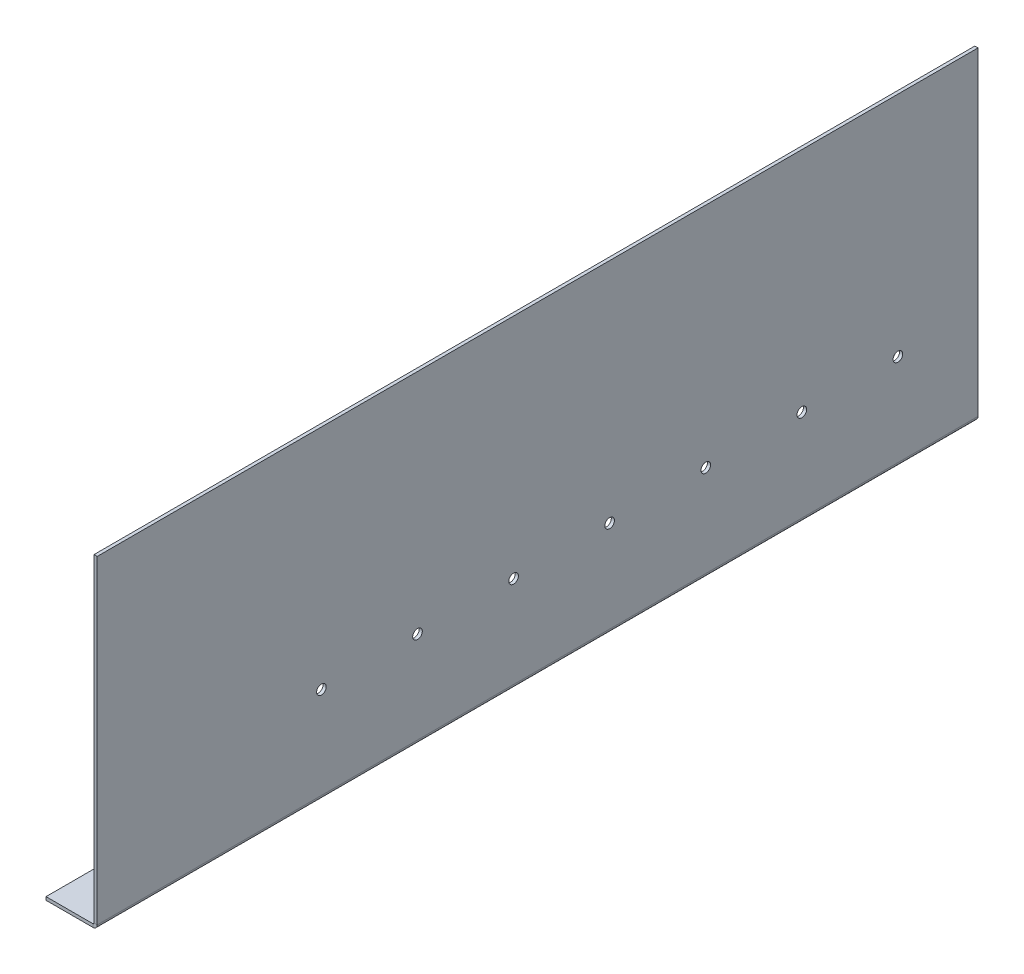
ISO-10303-21;
HEADER;
FILE_DESCRIPTION(('STEP AP214'),'2;1');
FILE_NAME('part.step','',(''),(''),'','','');
FILE_SCHEMA(('AUTOMOTIVE_DESIGN { 1 0 10303 214 1 1 1 1 }'));
ENDSEC;
DATA;
#1=APPLICATION_CONTEXT('core data for automotive mechanical design processes');
#2=APPLICATION_PROTOCOL_DEFINITION('international standard','automotive_design',2000,#1);
#3=PRODUCT_CONTEXT('',#1,'mechanical');
#4=PRODUCT('Part','Part','',(#3));
#5=PRODUCT_RELATED_PRODUCT_CATEGORY('part','',(#4));
#6=PRODUCT_DEFINITION_FORMATION('','',#4);
#7=PRODUCT_DEFINITION_CONTEXT('part definition',#1,'design');
#8=PRODUCT_DEFINITION('design','',#6,#7);
#9=PRODUCT_DEFINITION_SHAPE('','',#8);
#10=(LENGTH_UNIT() NAMED_UNIT(*) SI_UNIT(.MILLI.,.METRE.));
#11=(NAMED_UNIT(*) PLANE_ANGLE_UNIT() SI_UNIT($,.RADIAN.));
#12=(NAMED_UNIT(*) SI_UNIT($,.STERADIAN.) SOLID_ANGLE_UNIT());
#13=UNCERTAINTY_MEASURE_WITH_UNIT(LENGTH_MEASURE(1.E-05),#10,'distance_accuracy_value','');
#14=(GEOMETRIC_REPRESENTATION_CONTEXT(3) GLOBAL_UNCERTAINTY_ASSIGNED_CONTEXT((#13)) GLOBAL_UNIT_ASSIGNED_CONTEXT((#10,
#11,#12)) REPRESENTATION_CONTEXT('',''));
#15=CARTESIAN_POINT('',(0.,0.,0.));
#16=DIRECTION('',(0.,0.,1.));
#17=DIRECTION('',(1.,0.,0.));
#18=AXIS2_PLACEMENT_3D('',#15,#16,#17);
#19=CARTESIAN_POINT('',(30.,0.7366,550.));
#20=DIRECTION('',(0.,0.,1.));
#21=DIRECTION('',(1.,0.,0.));
#22=AXIS2_PLACEMENT_3D('',#19,#20,#21);
#23=PLANE('',#22);
#24=DIRECTION('',(1.,0.,0.));
#25=VECTOR('',#24,1.);
#26=CARTESIAN_POINT('',(30.,0.7366,550.));
#27=LINE('',#26,#25);
#28=CARTESIAN_POINT('',(30.,0.7366,550.));
#29=VERTEX_POINT('',#28);
#30=CARTESIAN_POINT('',(32.,0.7366,550.));
#31=VERTEX_POINT('',#30);
#32=EDGE_CURVE('E11',#29,#31,#27,.T.);
#33=ORIENTED_EDGE('',*,*,#32,.F.);
#34=CARTESIAN_POINT('',(29.2634,0.7366,550.));
#35=DIRECTION('',(0.,0.,-1.));
#36=DIRECTION('',(-1.,0.,0.));
#37=AXIS2_PLACEMENT_3D('',#34,#35,#36);
#38=CIRCLE('',#37,0.7366);
#39=CARTESIAN_POINT('',(29.2634,0.,550.));
#40=VERTEX_POINT('',#39);
#41=EDGE_CURVE('E138',#40,#29,#38,.F.);
#42=ORIENTED_EDGE('',*,*,#41,.F.);
#43=DIRECTION('',(0.,1.,0.));
#44=VECTOR('',#43,1.);
#45=CARTESIAN_POINT('',(29.2634,-2.,550.));
#46=LINE('',#45,#44);
#47=CARTESIAN_POINT('',(29.2634,-2.,550.));
#48=VERTEX_POINT('',#47);
#49=EDGE_CURVE('E48',#48,#40,#46,.T.);
#50=ORIENTED_EDGE('',*,*,#49,.F.);
#51=CARTESIAN_POINT('',(29.2634,0.7366,550.));
#52=DIRECTION('',(0.,0.,1.));
#53=DIRECTION('',(1.,0.,0.));
#54=AXIS2_PLACEMENT_3D('',#51,#52,#53);
#55=CIRCLE('',#54,2.7366);
#56=EDGE_CURVE('E131',#48,#31,#55,.T.);
#57=ORIENTED_EDGE('',*,*,#56,.T.);
#58=EDGE_LOOP('',(#33,#42,#50,#57));
#59=FACE_BOUND('',#58,.T.);
#60=ADVANCED_FACE('F39',(#59),#23,.T.);
#61=CARTESIAN_POINT('',(29.2634,-2.,550.));
#62=DIRECTION('',(0.,0.,1.));
#63=DIRECTION('',(1.,0.,0.));
#64=AXIS2_PLACEMENT_3D('',#61,#62,#63);
#65=PLANE('',#64);
#66=DIRECTION('',(0.,1.,0.));
#67=VECTOR('',#66,1.);
#68=CARTESIAN_POINT('',(30.,0.,550.));
#69=LINE('',#68,#67);
#70=CARTESIAN_POINT('',(30.,200.,550.));
#71=VERTEX_POINT('',#70);
#72=EDGE_CURVE('E259',#29,#71,#69,.T.);
#73=ORIENTED_EDGE('',*,*,#72,.F.);
#74=ORIENTED_EDGE('',*,*,#32,.T.);
#75=DIRECTION('',(0.,1.,0.));
#76=VECTOR('',#75,1.);
#77=CARTESIAN_POINT('',(32.,0.,550.));
#78=LINE('',#77,#76);
#79=CARTESIAN_POINT('',(32.,200.,550.));
#80=VERTEX_POINT('',#79);
#81=EDGE_CURVE('E97',#31,#80,#78,.T.);
#82=ORIENTED_EDGE('',*,*,#81,.T.);
#83=DIRECTION('',(1.,0.,0.));
#84=VECTOR('',#83,1.);
#85=CARTESIAN_POINT('',(30.,200.,550.));
#86=LINE('',#85,#84);
#87=EDGE_CURVE('E257',#71,#80,#86,.T.);
#88=ORIENTED_EDGE('',*,*,#87,.F.);
#89=EDGE_LOOP('',(#73,#74,#82,#88));
#90=FACE_BOUND('',#89,.T.);
#91=ADVANCED_FACE('F245',(#90),#65,.T.);
#92=CARTESIAN_POINT('',(29.2634,0.,0.));
#93=DIRECTION('',(0.,0.,-1.));
#94=DIRECTION('',(-1.,0.,0.));
#95=AXIS2_PLACEMENT_3D('',#92,#93,#94);
#96=PLANE('',#95);
#97=DIRECTION('',(0.,-1.,0.));
#98=VECTOR('',#97,1.);
#99=CARTESIAN_POINT('',(29.2634,0.,0.));
#100=LINE('',#99,#98);
#101=CARTESIAN_POINT('',(29.2634,0.,0.));
#102=VERTEX_POINT('',#101);
#103=CARTESIAN_POINT('',(29.2634,-2.,0.));
#104=VERTEX_POINT('',#103);
#105=EDGE_CURVE('E84',#102,#104,#100,.T.);
#106=ORIENTED_EDGE('',*,*,#105,.F.);
#107=CARTESIAN_POINT('',(29.2634,0.7366,0.));
#108=DIRECTION('',(0.,0.,-1.));
#109=DIRECTION('',(-1.,0.,0.));
#110=AXIS2_PLACEMENT_3D('',#107,#108,#109);
#111=CIRCLE('',#110,0.7366);
#112=CARTESIAN_POINT('',(30.,0.7366,0.));
#113=VERTEX_POINT('',#112);
#114=EDGE_CURVE('E153',#102,#113,#111,.F.);
#115=ORIENTED_EDGE('',*,*,#114,.T.);
#116=DIRECTION('',(-1.,0.,0.));
#117=VECTOR('',#116,1.);
#118=CARTESIAN_POINT('',(32.,0.7366,0.));
#119=LINE('',#118,#117);
#120=CARTESIAN_POINT('',(32.,0.7366,0.));
#121=VERTEX_POINT('',#120);
#122=EDGE_CURVE('E91',#121,#113,#119,.T.);
#123=ORIENTED_EDGE('',*,*,#122,.F.);
#124=CARTESIAN_POINT('',(29.2634,0.7366,0.));
#125=DIRECTION('',(0.,0.,1.));
#126=DIRECTION('',(1.,0.,0.));
#127=AXIS2_PLACEMENT_3D('',#124,#125,#126);
#128=CIRCLE('',#127,2.7366);
#129=EDGE_CURVE('E160',#104,#121,#128,.T.);
#130=ORIENTED_EDGE('',*,*,#129,.F.);
#131=EDGE_LOOP('',(#106,#115,#123,#130));
#132=FACE_BOUND('',#131,.T.);
#133=ADVANCED_FACE('F227',(#132),#96,.T.);
#134=CARTESIAN_POINT('',(32.,0.7366,0.));
#135=DIRECTION('',(0.,0.,-1.));
#136=DIRECTION('',(-1.,0.,0.));
#137=AXIS2_PLACEMENT_3D('',#134,#135,#136);
#138=PLANE('',#137);
#139=DIRECTION('',(1.,0.,0.));
#140=VECTOR('',#139,1.);
#141=CARTESIAN_POINT('',(0.,0.,0.));
#142=LINE('',#141,#140);
#143=CARTESIAN_POINT('',(0.,0.,0.));
#144=VERTEX_POINT('',#143);
#145=EDGE_CURVE('E155',#144,#102,#142,.T.);
#146=ORIENTED_EDGE('',*,*,#145,.T.);
#147=ORIENTED_EDGE('',*,*,#105,.T.);
#148=DIRECTION('',(1.,0.,0.));
#149=VECTOR('',#148,1.);
#150=CARTESIAN_POINT('',(0.,-2.,0.));
#151=LINE('',#150,#149);
#152=CARTESIAN_POINT('',(0.,-2.,0.));
#153=VERTEX_POINT('',#152);
#154=EDGE_CURVE('E158',#153,#104,#151,.T.);
#155=ORIENTED_EDGE('',*,*,#154,.F.);
#156=DIRECTION('',(0.,1.,0.));
#157=VECTOR('',#156,1.);
#158=CARTESIAN_POINT('',(0.,-2.,0.));
#159=LINE('',#158,#157);
#160=EDGE_CURVE('E119',#153,#144,#159,.T.);
#161=ORIENTED_EDGE('',*,*,#160,.T.);
#162=EDGE_LOOP('',(#146,#147,#155,#161));
#163=FACE_BOUND('',#162,.T.);
#164=ADVANCED_FACE('F233',(#163),#138,.T.);
#165=CARTESIAN_POINT('',(32.,0.,550.));
#166=DIRECTION('',(-1.,0.,0.));
#167=DIRECTION('',(0.,0.,1.));
#168=AXIS2_PLACEMENT_3D('',#165,#166,#167);
#169=PLANE('',#168);
#170=CARTESIAN_POINT('',(32.,58.,50.));
#171=DIRECTION('',(1.,0.,0.));
#172=DIRECTION('',(0.,0.,-1.));
#173=AXIS2_PLACEMENT_3D('',#170,#171,#172);
#174=CIRCLE('',#173,3.00000000000001);
#175=CARTESIAN_POINT('',(32.,58.,47.));
#176=VERTEX_POINT('',#175);
#177=EDGE_CURVE('E183',#176,#176,#174,.T.);
#178=ORIENTED_EDGE('',*,*,#177,.F.);
#179=EDGE_LOOP('',(#178));
#180=FACE_BOUND('',#179,.T.);
#181=CARTESIAN_POINT('',(32.,58.,110.));
#182=DIRECTION('',(1.,0.,0.));
#183=DIRECTION('',(0.,0.,-1.));
#184=AXIS2_PLACEMENT_3D('',#181,#182,#183);
#185=CIRCLE('',#184,2.99999999999999);
#186=CARTESIAN_POINT('',(32.,58.,107.));
#187=VERTEX_POINT('',#186);
#188=EDGE_CURVE('E476',#187,#187,#185,.T.);
#189=ORIENTED_EDGE('',*,*,#188,.F.);
#190=EDGE_LOOP('',(#189));
#191=FACE_BOUND('',#190,.T.);
#192=CARTESIAN_POINT('',(32.,58.,170.));
#193=DIRECTION('',(1.,0.,0.));
#194=DIRECTION('',(0.,0.,-1.));
#195=AXIS2_PLACEMENT_3D('',#192,#193,#194);
#196=CIRCLE('',#195,2.99999999999999);
#197=CARTESIAN_POINT('',(32.,58.,167.));
#198=VERTEX_POINT('',#197);
#199=EDGE_CURVE('E478',#198,#198,#196,.T.);
#200=ORIENTED_EDGE('',*,*,#199,.F.);
#201=EDGE_LOOP('',(#200));
#202=FACE_BOUND('',#201,.T.);
#203=CARTESIAN_POINT('',(32.,58.,230.));
#204=DIRECTION('',(1.,0.,0.));
#205=DIRECTION('',(0.,0.,-1.));
#206=AXIS2_PLACEMENT_3D('',#203,#204,#205);
#207=CIRCLE('',#206,2.99999999999999);
#208=CARTESIAN_POINT('',(32.,58.,227.));
#209=VERTEX_POINT('',#208);
#210=EDGE_CURVE('E483',#209,#209,#207,.T.);
#211=ORIENTED_EDGE('',*,*,#210,.F.);
#212=EDGE_LOOP('',(#211));
#213=FACE_BOUND('',#212,.T.);
#214=CARTESIAN_POINT('',(32.,58.,290.));
#215=DIRECTION('',(1.,0.,0.));
#216=DIRECTION('',(0.,0.,-1.));
#217=AXIS2_PLACEMENT_3D('',#214,#215,#216);
#218=CIRCLE('',#217,2.99999999999999);
#219=CARTESIAN_POINT('',(32.,58.,287.));
#220=VERTEX_POINT('',#219);
#221=EDGE_CURVE('E488',#220,#220,#218,.T.);
#222=ORIENTED_EDGE('',*,*,#221,.F.);
#223=EDGE_LOOP('',(#222));
#224=FACE_BOUND('',#223,.T.);
#225=CARTESIAN_POINT('',(32.,58.,350.));
#226=DIRECTION('',(1.,0.,0.));
#227=DIRECTION('',(0.,0.,-1.));
#228=AXIS2_PLACEMENT_3D('',#225,#226,#227);
#229=CIRCLE('',#228,3.00000000000005);
#230=CARTESIAN_POINT('',(32.,58.,347.));
#231=VERTEX_POINT('',#230);
#232=EDGE_CURVE('E490',#231,#231,#229,.T.);
#233=ORIENTED_EDGE('',*,*,#232,.F.);
#234=EDGE_LOOP('',(#233));
#235=FACE_BOUND('',#234,.T.);
#236=CARTESIAN_POINT('',(32.,58.,410.));
#237=DIRECTION('',(1.,0.,0.));
#238=DIRECTION('',(0.,0.,-1.));
#239=AXIS2_PLACEMENT_3D('',#236,#237,#238);
#240=CIRCLE('',#239,2.99999999999999);
#241=CARTESIAN_POINT('',(32.,58.,407.));
#242=VERTEX_POINT('',#241);
#243=EDGE_CURVE('E262',#242,#242,#240,.T.);
#244=ORIENTED_EDGE('',*,*,#243,.F.);
#245=EDGE_LOOP('',(#244));
#246=FACE_BOUND('',#245,.T.);
#247=DIRECTION('',(0.,1.,0.));
#248=VECTOR('',#247,1.);
#249=CARTESIAN_POINT('',(32.,0.,0.));
#250=LINE('',#249,#248);
#251=CARTESIAN_POINT('',(32.,200.,0.));
#252=VERTEX_POINT('',#251);
#253=EDGE_CURVE('E144',#121,#252,#250,.T.);
#254=ORIENTED_EDGE('',*,*,#253,.T.);
#255=DIRECTION('',(0.,0.,-1.));
#256=VECTOR('',#255,1.);
#257=CARTESIAN_POINT('',(32.,200.,550.));
#258=LINE('',#257,#256);
#259=EDGE_CURVE('E174',#80,#252,#258,.T.);
#260=ORIENTED_EDGE('',*,*,#259,.F.);
#261=ORIENTED_EDGE('',*,*,#81,.F.);
#262=DIRECTION('',(0.,0.,-1.));
#263=VECTOR('',#262,1.);
#264=CARTESIAN_POINT('',(32.,0.7366,550.));
#265=LINE('',#264,#263);
#266=EDGE_CURVE('E143',#31,#121,#265,.T.);
#267=ORIENTED_EDGE('',*,*,#266,.T.);
#268=EDGE_LOOP('',(#254,#260,#261,#267));
#269=FACE_BOUND('',#268,.T.);
#270=ADVANCED_FACE('F255',(#180,#191,#202,#213,#224,#235,#246,#269),#169,.F.);
#271=CARTESIAN_POINT('',(30.,200.,550.));
#272=DIRECTION('',(0.,1.,0.));
#273=DIRECTION('',(0.,0.,1.));
#274=AXIS2_PLACEMENT_3D('',#271,#272,#273);
#275=PLANE('',#274);
#276=DIRECTION('',(1.,0.,0.));
#277=VECTOR('',#276,1.);
#278=CARTESIAN_POINT('',(30.,200.,0.));
#279=LINE('',#278,#277);
#280=CARTESIAN_POINT('',(30.,200.,0.));
#281=VERTEX_POINT('',#280);
#282=EDGE_CURVE('E147',#281,#252,#279,.T.);
#283=ORIENTED_EDGE('',*,*,#282,.F.);
#284=DIRECTION('',(0.,0.,-1.));
#285=VECTOR('',#284,1.);
#286=CARTESIAN_POINT('',(30.,200.,550.));
#287=LINE('',#286,#285);
#288=EDGE_CURVE('E172',#71,#281,#287,.T.);
#289=ORIENTED_EDGE('',*,*,#288,.F.);
#290=ORIENTED_EDGE('',*,*,#87,.T.);
#291=ORIENTED_EDGE('',*,*,#259,.T.);
#292=EDGE_LOOP('',(#283,#289,#290,#291));
#293=FACE_BOUND('',#292,.T.);
#294=ADVANCED_FACE('F208',(#293),#275,.T.);
#295=CARTESIAN_POINT('',(30.,0.,550.));
#296=DIRECTION('',(-1.,0.,0.));
#297=DIRECTION('',(0.,0.,1.));
#298=AXIS2_PLACEMENT_3D('',#295,#296,#297);
#299=PLANE('',#298);
#300=CARTESIAN_POINT('',(30.,58.,50.));
#301=DIRECTION('',(-1.,0.,0.));
#302=DIRECTION('',(0.,0.,1.));
#303=AXIS2_PLACEMENT_3D('',#300,#301,#302);
#304=CIRCLE('',#303,3.00000000000001);
#305=CARTESIAN_POINT('',(30.,58.,53.0000000000001));
#306=VERTEX_POINT('',#305);
#307=EDGE_CURVE('E42',#306,#306,#304,.T.);
#308=ORIENTED_EDGE('',*,*,#307,.F.);
#309=EDGE_LOOP('',(#308));
#310=FACE_BOUND('',#309,.T.);
#311=CARTESIAN_POINT('',(30.,58.,110.));
#312=DIRECTION('',(-1.,0.,0.));
#313=DIRECTION('',(0.,0.,1.));
#314=AXIS2_PLACEMENT_3D('',#311,#312,#313);
#315=CIRCLE('',#314,2.99999999999999);
#316=CARTESIAN_POINT('',(30.,58.,113.));
#317=VERTEX_POINT('',#316);
#318=EDGE_CURVE('E194',#317,#317,#315,.T.);
#319=ORIENTED_EDGE('',*,*,#318,.F.);
#320=EDGE_LOOP('',(#319));
#321=FACE_BOUND('',#320,.T.);
#322=CARTESIAN_POINT('',(30.,58.,170.));
#323=DIRECTION('',(-1.,0.,0.));
#324=DIRECTION('',(0.,0.,1.));
#325=AXIS2_PLACEMENT_3D('',#322,#323,#324);
#326=CIRCLE('',#325,2.99999999999999);
#327=CARTESIAN_POINT('',(30.,58.,173.));
#328=VERTEX_POINT('',#327);
#329=EDGE_CURVE('E192',#328,#328,#326,.T.);
#330=ORIENTED_EDGE('',*,*,#329,.F.);
#331=EDGE_LOOP('',(#330));
#332=FACE_BOUND('',#331,.T.);
#333=CARTESIAN_POINT('',(30.,58.,230.));
#334=DIRECTION('',(-1.,0.,0.));
#335=DIRECTION('',(0.,0.,1.));
#336=AXIS2_PLACEMENT_3D('',#333,#334,#335);
#337=CIRCLE('',#336,2.99999999999999);
#338=CARTESIAN_POINT('',(30.,58.,233.));
#339=VERTEX_POINT('',#338);
#340=EDGE_CURVE('E189',#339,#339,#337,.T.);
#341=ORIENTED_EDGE('',*,*,#340,.F.);
#342=EDGE_LOOP('',(#341));
#343=FACE_BOUND('',#342,.T.);
#344=CARTESIAN_POINT('',(30.,58.,290.));
#345=DIRECTION('',(-1.,0.,0.));
#346=DIRECTION('',(0.,0.,1.));
#347=AXIS2_PLACEMENT_3D('',#344,#345,#346);
#348=CIRCLE('',#347,2.99999999999999);
#349=CARTESIAN_POINT('',(30.,58.,293.));
#350=VERTEX_POINT('',#349);
#351=EDGE_CURVE('E186',#350,#350,#348,.T.);
#352=ORIENTED_EDGE('',*,*,#351,.F.);
#353=EDGE_LOOP('',(#352));
#354=FACE_BOUND('',#353,.T.);
#355=CARTESIAN_POINT('',(30.,58.,350.));
#356=DIRECTION('',(-1.,0.,0.));
#357=DIRECTION('',(0.,0.,1.));
#358=AXIS2_PLACEMENT_3D('',#355,#356,#357);
#359=CIRCLE('',#358,3.00000000000005);
#360=CARTESIAN_POINT('',(30.,58.,353.));
#361=VERTEX_POINT('',#360);
#362=EDGE_CURVE('E182',#361,#361,#359,.T.);
#363=ORIENTED_EDGE('',*,*,#362,.F.);
#364=EDGE_LOOP('',(#363));
#365=FACE_BOUND('',#364,.T.);
#366=CARTESIAN_POINT('',(30.,58.,410.));
#367=DIRECTION('',(-1.,0.,0.));
#368=DIRECTION('',(0.,0.,1.));
#369=AXIS2_PLACEMENT_3D('',#366,#367,#368);
#370=CIRCLE('',#369,2.99999999999999);
#371=CARTESIAN_POINT('',(30.,58.,413.));
#372=VERTEX_POINT('',#371);
#373=EDGE_CURVE('E179',#372,#372,#370,.T.);
#374=ORIENTED_EDGE('',*,*,#373,.F.);
#375=EDGE_LOOP('',(#374));
#376=FACE_BOUND('',#375,.T.);
#377=DIRECTION('',(0.,1.,0.));
#378=VECTOR('',#377,1.);
#379=CARTESIAN_POINT('',(30.,0.,0.));
#380=LINE('',#379,#378);
#381=EDGE_CURVE('E150',#113,#281,#380,.T.);
#382=ORIENTED_EDGE('',*,*,#381,.F.);
#383=DIRECTION('',(0.,0.,-1.));
#384=VECTOR('',#383,1.);
#385=CARTESIAN_POINT('',(30.,0.7366,550.));
#386=LINE('',#385,#384);
#387=EDGE_CURVE('E169',#29,#113,#386,.T.);
#388=ORIENTED_EDGE('',*,*,#387,.F.);
#389=ORIENTED_EDGE('',*,*,#72,.T.);
#390=ORIENTED_EDGE('',*,*,#288,.T.);
#391=EDGE_LOOP('',(#382,#388,#389,#390));
#392=FACE_BOUND('',#391,.T.);
#393=ADVANCED_FACE('F204',(#310,#321,#332,#343,#354,#365,#376,#392),#299,.T.);
#394=CARTESIAN_POINT('',(29.2634,0.7366,550.));
#395=DIRECTION('',(0.,0.,-1.));
#396=DIRECTION('',(-1.,0.,0.));
#397=AXIS2_PLACEMENT_3D('',#394,#395,#396);
#398=CYLINDRICAL_SURFACE('',#397,0.7366);
#399=ORIENTED_EDGE('',*,*,#114,.F.);
#400=DIRECTION('',(0.,0.,-1.));
#401=VECTOR('',#400,1.);
#402=CARTESIAN_POINT('',(29.2634,0.,550.));
#403=LINE('',#402,#401);
#404=EDGE_CURVE('E166',#40,#102,#403,.T.);
#405=ORIENTED_EDGE('',*,*,#404,.F.);
#406=ORIENTED_EDGE('',*,*,#41,.T.);
#407=ORIENTED_EDGE('',*,*,#387,.T.);
#408=EDGE_LOOP('',(#399,#405,#406,#407));
#409=FACE_BOUND('',#408,.T.);
#410=ADVANCED_FACE('F207',(#409),#398,.F.);
#411=CARTESIAN_POINT('',(0.,0.,550.));
#412=DIRECTION('',(0.,1.,0.));
#413=DIRECTION('',(0.,0.,1.));
#414=AXIS2_PLACEMENT_3D('',#411,#412,#413);
#415=PLANE('',#414);
#416=ORIENTED_EDGE('',*,*,#145,.F.);
#417=DIRECTION('',(0.,0.,-1.));
#418=VECTOR('',#417,1.);
#419=CARTESIAN_POINT('',(0.,0.,550.));
#420=LINE('',#419,#418);
#421=CARTESIAN_POINT('',(0.,0.,550.));
#422=VERTEX_POINT('',#421);
#423=EDGE_CURVE('E121',#422,#144,#420,.T.);
#424=ORIENTED_EDGE('',*,*,#423,.F.);
#425=DIRECTION('',(1.,0.,0.));
#426=VECTOR('',#425,1.);
#427=CARTESIAN_POINT('',(0.,0.,550.));
#428=LINE('',#427,#426);
#429=EDGE_CURVE('E136',#422,#40,#428,.T.);
#430=ORIENTED_EDGE('',*,*,#429,.T.);
#431=ORIENTED_EDGE('',*,*,#404,.T.);
#432=EDGE_LOOP('',(#416,#424,#430,#431));
#433=FACE_BOUND('',#432,.T.);
#434=ADVANCED_FACE('F235',(#433),#415,.T.);
#435=CARTESIAN_POINT('',(0.,-2.,550.));
#436=DIRECTION('',(-1.,0.,0.));
#437=DIRECTION('',(0.,0.,1.));
#438=AXIS2_PLACEMENT_3D('',#435,#436,#437);
#439=PLANE('',#438);
#440=ORIENTED_EDGE('',*,*,#160,.F.);
#441=DIRECTION('',(0.,0.,-1.));
#442=VECTOR('',#441,1.);
#443=CARTESIAN_POINT('',(0.,-2.,550.));
#444=LINE('',#443,#442);
#445=CARTESIAN_POINT('',(0.,-2.,550.));
#446=VERTEX_POINT('',#445);
#447=EDGE_CURVE('E113',#446,#153,#444,.T.);
#448=ORIENTED_EDGE('',*,*,#447,.F.);
#449=DIRECTION('',(0.,1.,0.));
#450=VECTOR('',#449,1.);
#451=CARTESIAN_POINT('',(0.,-2.,550.));
#452=LINE('',#451,#450);
#453=EDGE_CURVE('E117',#446,#422,#452,.T.);
#454=ORIENTED_EDGE('',*,*,#453,.T.);
#455=ORIENTED_EDGE('',*,*,#423,.T.);
#456=EDGE_LOOP('',(#440,#448,#454,#455));
#457=FACE_BOUND('',#456,.T.);
#458=ADVANCED_FACE('F115',(#457),#439,.T.);
#459=CARTESIAN_POINT('',(0.,-2.,550.));
#460=DIRECTION('',(0.,1.,0.));
#461=DIRECTION('',(0.,0.,1.));
#462=AXIS2_PLACEMENT_3D('',#459,#460,#461);
#463=PLANE('',#462);
#464=ORIENTED_EDGE('',*,*,#154,.T.);
#465=DIRECTION('',(0.,0.,-1.));
#466=VECTOR('',#465,1.);
#467=CARTESIAN_POINT('',(29.2634,-2.,550.));
#468=LINE('',#467,#466);
#469=EDGE_CURVE('E122',#48,#104,#468,.T.);
#470=ORIENTED_EDGE('',*,*,#469,.F.);
#471=DIRECTION('',(1.,0.,0.));
#472=VECTOR('',#471,1.);
#473=CARTESIAN_POINT('',(0.,-2.,550.));
#474=LINE('',#473,#472);
#475=EDGE_CURVE('E126',#446,#48,#474,.T.);
#476=ORIENTED_EDGE('',*,*,#475,.F.);
#477=ORIENTED_EDGE('',*,*,#447,.T.);
#478=EDGE_LOOP('',(#464,#470,#476,#477));
#479=FACE_BOUND('',#478,.T.);
#480=ADVANCED_FACE('F127',(#479),#463,.F.);
#481=CARTESIAN_POINT('',(29.2634,0.7366,550.));
#482=DIRECTION('',(0.,0.,-1.));
#483=DIRECTION('',(-1.,0.,0.));
#484=AXIS2_PLACEMENT_3D('',#481,#482,#483);
#485=CYLINDRICAL_SURFACE('',#484,2.7366);
#486=ORIENTED_EDGE('',*,*,#129,.T.);
#487=ORIENTED_EDGE('',*,*,#266,.F.);
#488=ORIENTED_EDGE('',*,*,#56,.F.);
#489=ORIENTED_EDGE('',*,*,#469,.T.);
#490=EDGE_LOOP('',(#486,#487,#488,#489));
#491=FACE_BOUND('',#490,.T.);
#492=ADVANCED_FACE('F252',(#491),#485,.T.);
#493=CARTESIAN_POINT('',(29.2634,0.7366,550.));
#494=DIRECTION('',(0.,0.,-1.));
#495=DIRECTION('',(-1.,0.,0.));
#496=AXIS2_PLACEMENT_3D('',#493,#494,#495);
#497=PLANE('',#496);
#498=ORIENTED_EDGE('',*,*,#475,.T.);
#499=ORIENTED_EDGE('',*,*,#49,.T.);
#500=ORIENTED_EDGE('',*,*,#429,.F.);
#501=ORIENTED_EDGE('',*,*,#453,.F.);
#502=EDGE_LOOP('',(#498,#499,#500,#501));
#503=FACE_BOUND('',#502,.T.);
#504=ADVANCED_FACE('F134',(#503),#497,.F.);
#505=CARTESIAN_POINT('',(29.2634,0.7366,0.));
#506=DIRECTION('',(0.,0.,-1.));
#507=DIRECTION('',(-1.,0.,0.));
#508=AXIS2_PLACEMENT_3D('',#505,#506,#507);
#509=PLANE('',#508);
#510=ORIENTED_EDGE('',*,*,#253,.F.);
#511=ORIENTED_EDGE('',*,*,#122,.T.);
#512=ORIENTED_EDGE('',*,*,#381,.T.);
#513=ORIENTED_EDGE('',*,*,#282,.T.);
#514=EDGE_LOOP('',(#510,#511,#512,#513));
#515=FACE_BOUND('',#514,.T.);
#516=ADVANCED_FACE('F266',(#515),#509,.T.);
#517=CARTESIAN_POINT('',(22.,58.,410.));
#518=DIRECTION('',(1.,0.,0.));
#519=DIRECTION('',(0.,0.,-1.));
#520=AXIS2_PLACEMENT_3D('',#517,#518,#519);
#521=CYLINDRICAL_SURFACE('',#520,2.99999999999999);
#522=ORIENTED_EDGE('',*,*,#373,.T.);
#523=EDGE_LOOP('',(#522));
#524=FACE_BOUND('',#523,.T.);
#525=ORIENTED_EDGE('',*,*,#243,.T.);
#526=EDGE_LOOP('',(#525));
#527=FACE_BOUND('',#526,.T.);
#528=ADVANCED_FACE('F268',(#524,#527),#521,.F.);
#529=CARTESIAN_POINT('',(22.,58.,350.));
#530=DIRECTION('',(1.,0.,0.));
#531=DIRECTION('',(0.,0.,-1.));
#532=AXIS2_PLACEMENT_3D('',#529,#530,#531);
#533=CYLINDRICAL_SURFACE('',#532,3.00000000000005);
#534=ORIENTED_EDGE('',*,*,#362,.T.);
#535=EDGE_LOOP('',(#534));
#536=FACE_BOUND('',#535,.T.);
#537=ORIENTED_EDGE('',*,*,#232,.T.);
#538=EDGE_LOOP('',(#537));
#539=FACE_BOUND('',#538,.T.);
#540=ADVANCED_FACE('F274',(#536,#539),#533,.F.);
#541=CARTESIAN_POINT('',(22.,58.,290.));
#542=DIRECTION('',(1.,0.,0.));
#543=DIRECTION('',(0.,0.,-1.));
#544=AXIS2_PLACEMENT_3D('',#541,#542,#543);
#545=CYLINDRICAL_SURFACE('',#544,2.99999999999999);
#546=ORIENTED_EDGE('',*,*,#351,.T.);
#547=EDGE_LOOP('',(#546));
#548=FACE_BOUND('',#547,.T.);
#549=ORIENTED_EDGE('',*,*,#221,.T.);
#550=EDGE_LOOP('',(#549));
#551=FACE_BOUND('',#550,.T.);
#552=ADVANCED_FACE('F338',(#548,#551),#545,.F.);
#553=CARTESIAN_POINT('',(22.,58.,230.));
#554=DIRECTION('',(1.,0.,0.));
#555=DIRECTION('',(0.,0.,-1.));
#556=AXIS2_PLACEMENT_3D('',#553,#554,#555);
#557=CYLINDRICAL_SURFACE('',#556,2.99999999999999);
#558=ORIENTED_EDGE('',*,*,#340,.T.);
#559=EDGE_LOOP('',(#558));
#560=FACE_BOUND('',#559,.T.);
#561=ORIENTED_EDGE('',*,*,#210,.T.);
#562=EDGE_LOOP('',(#561));
#563=FACE_BOUND('',#562,.T.);
#564=ADVANCED_FACE('F349',(#560,#563),#557,.F.);
#565=CARTESIAN_POINT('',(22.,58.,170.));
#566=DIRECTION('',(1.,0.,0.));
#567=DIRECTION('',(0.,0.,-1.));
#568=AXIS2_PLACEMENT_3D('',#565,#566,#567);
#569=CYLINDRICAL_SURFACE('',#568,2.99999999999999);
#570=ORIENTED_EDGE('',*,*,#329,.T.);
#571=EDGE_LOOP('',(#570));
#572=FACE_BOUND('',#571,.T.);
#573=ORIENTED_EDGE('',*,*,#199,.T.);
#574=EDGE_LOOP('',(#573));
#575=FACE_BOUND('',#574,.T.);
#576=ADVANCED_FACE('F360',(#572,#575),#569,.F.);
#577=CARTESIAN_POINT('',(22.,58.,110.));
#578=DIRECTION('',(1.,0.,0.));
#579=DIRECTION('',(0.,0.,-1.));
#580=AXIS2_PLACEMENT_3D('',#577,#578,#579);
#581=CYLINDRICAL_SURFACE('',#580,2.99999999999999);
#582=ORIENTED_EDGE('',*,*,#318,.T.);
#583=EDGE_LOOP('',(#582));
#584=FACE_BOUND('',#583,.T.);
#585=ORIENTED_EDGE('',*,*,#188,.T.);
#586=EDGE_LOOP('',(#585));
#587=FACE_BOUND('',#586,.T.);
#588=ADVANCED_FACE('F371',(#584,#587),#581,.F.);
#589=CARTESIAN_POINT('',(22.,58.,50.));
#590=DIRECTION('',(1.,0.,0.));
#591=DIRECTION('',(0.,0.,-1.));
#592=AXIS2_PLACEMENT_3D('',#589,#590,#591);
#593=CYLINDRICAL_SURFACE('',#592,3.00000000000001);
#594=ORIENTED_EDGE('',*,*,#307,.T.);
#595=EDGE_LOOP('',(#594));
#596=FACE_BOUND('',#595,.T.);
#597=ORIENTED_EDGE('',*,*,#177,.T.);
#598=EDGE_LOOP('',(#597));
#599=FACE_BOUND('',#598,.T.);
#600=ADVANCED_FACE('F201',(#596,#599),#593,.F.);
#601=CLOSED_SHELL('',(#60,#91,#133,#164,#270,#294,#393,#410,#434,#458,#480,#492,#504,#516,#528,
#540,#552,#564,#576,#588,#600));
#602=MANIFOLD_SOLID_BREP('B2',#601);
#603=ADVANCED_BREP_SHAPE_REPRESENTATION('',(#18,#602),#14);
#604=SHAPE_DEFINITION_REPRESENTATION(#9,#603);
ENDSEC;
END-ISO-10303-21;
